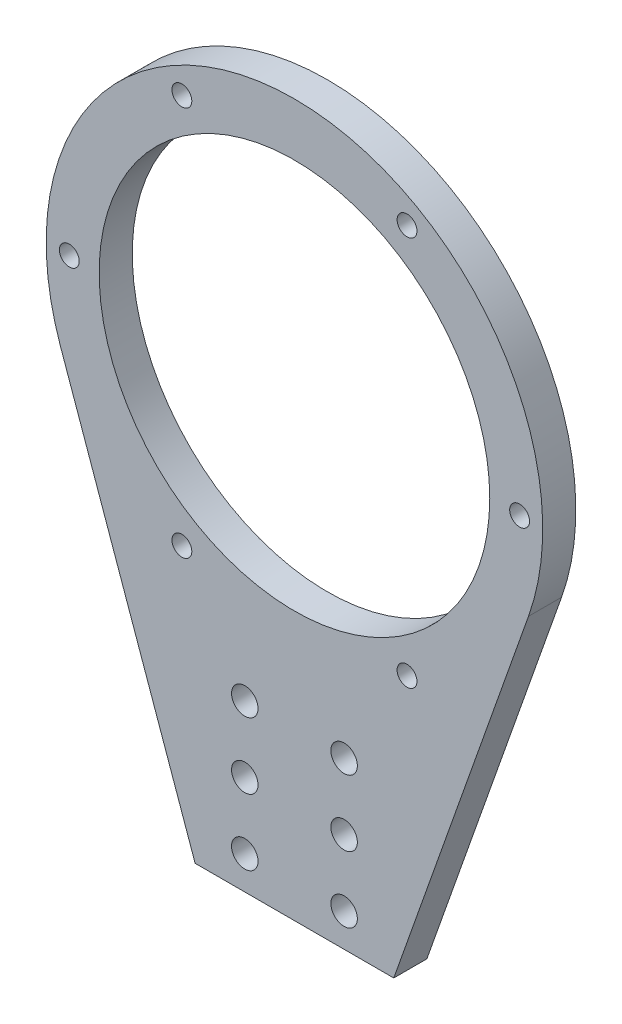
ISO-10303-21;
HEADER;
FILE_DESCRIPTION(('STEP AP214'),'2;1');
FILE_NAME('part.step','',(''),(''),'','','');
FILE_SCHEMA(('AUTOMOTIVE_DESIGN { 1 0 10303 214 1 1 1 1 }'));
ENDSEC;
DATA;
#1=APPLICATION_CONTEXT('core data for automotive mechanical design processes');
#2=APPLICATION_PROTOCOL_DEFINITION('international standard','automotive_design',2000,#1);
#3=PRODUCT_CONTEXT('',#1,'mechanical');
#4=PRODUCT('Part','Part','',(#3));
#5=PRODUCT_RELATED_PRODUCT_CATEGORY('part','',(#4));
#6=PRODUCT_DEFINITION_FORMATION('','',#4);
#7=PRODUCT_DEFINITION_CONTEXT('part definition',#1,'design');
#8=PRODUCT_DEFINITION('design','',#6,#7);
#9=PRODUCT_DEFINITION_SHAPE('','',#8);
#10=(LENGTH_UNIT() NAMED_UNIT(*) SI_UNIT(.MILLI.,.METRE.));
#11=(NAMED_UNIT(*) PLANE_ANGLE_UNIT() SI_UNIT($,.RADIAN.));
#12=(NAMED_UNIT(*) SI_UNIT($,.STERADIAN.) SOLID_ANGLE_UNIT());
#13=UNCERTAINTY_MEASURE_WITH_UNIT(LENGTH_MEASURE(1.E-05),#10,'distance_accuracy_value','');
#14=(GEOMETRIC_REPRESENTATION_CONTEXT(3) GLOBAL_UNCERTAINTY_ASSIGNED_CONTEXT((#13)) GLOBAL_UNIT_ASSIGNED_CONTEXT((#10,
#11,#12)) REPRESENTATION_CONTEXT('',''));
#15=CARTESIAN_POINT('',(0.,0.,0.));
#16=DIRECTION('',(0.,0.,1.));
#17=DIRECTION('',(1.,0.,0.));
#18=AXIS2_PLACEMENT_3D('',#15,#16,#17);
#19=CARTESIAN_POINT('',(0.,0.,5.));
#20=DIRECTION('',(0.,0.,-1.));
#21=DIRECTION('',(-1.,0.,0.));
#22=AXIS2_PLACEMENT_3D('',#19,#20,#21);
#23=CYLINDRICAL_SURFACE('',#22,37.5);
#24=CARTESIAN_POINT('',(0.,0.,0.));
#25=DIRECTION('',(0.,0.,1.));
#26=DIRECTION('',(1.,0.,0.));
#27=AXIS2_PLACEMENT_3D('',#24,#25,#26);
#28=CIRCLE('',#27,37.5);
#29=CARTESIAN_POINT('',(35.3503084476414,-12.5142196183625,0.));
#30=VERTEX_POINT('',#29);
#31=CARTESIAN_POINT('',(-35.3503084476414,-12.5142196183626,0.));
#32=VERTEX_POINT('',#31);
#33=EDGE_CURVE('E108',#30,#32,#28,.T.);
#34=ORIENTED_EDGE('',*,*,#33,.T.);
#35=DIRECTION('',(0.,0.,-1.));
#36=VECTOR('',#35,1.);
#37=CARTESIAN_POINT('',(-35.3503084476414,-12.5142196183626,5.));
#38=LINE('',#37,#36);
#39=CARTESIAN_POINT('',(-35.3503084476414,-12.5142196183626,5.));
#40=VERTEX_POINT('',#39);
#41=EDGE_CURVE('E11',#40,#32,#38,.T.);
#42=ORIENTED_EDGE('',*,*,#41,.F.);
#43=CARTESIAN_POINT('',(0.,0.,5.));
#44=DIRECTION('',(0.,0.,1.));
#45=DIRECTION('',(1.,0.,0.));
#46=AXIS2_PLACEMENT_3D('',#43,#44,#45);
#47=CIRCLE('',#46,37.5);
#48=CARTESIAN_POINT('',(35.3503084476414,-12.5142196183625,5.));
#49=VERTEX_POINT('',#48);
#50=EDGE_CURVE('E81',#49,#40,#47,.T.);
#51=ORIENTED_EDGE('',*,*,#50,.F.);
#52=DIRECTION('',(0.,0.,-1.));
#53=VECTOR('',#52,1.);
#54=CARTESIAN_POINT('',(35.3503084476414,-12.5142196183625,5.));
#55=LINE('',#54,#53);
#56=EDGE_CURVE('E104',#49,#30,#55,.T.);
#57=ORIENTED_EDGE('',*,*,#56,.T.);
#58=EDGE_LOOP('',(#34,#42,#51,#57));
#59=FACE_BOUND('',#58,.T.);
#60=ADVANCED_FACE('F36',(#59),#23,.T.);
#61=CARTESIAN_POINT('',(-35.3503084476414,-12.5142196183626,5.));
#62=DIRECTION('',(-0.942674891937105,-0.333712523156335,0.));
#63=DIRECTION('',(0.333712523156335,-0.942674891937105,0.));
#64=AXIS2_PLACEMENT_3D('',#61,#62,#63);
#65=PLANE('',#64);
#66=DIRECTION('',(-0.333712523156335,0.942674891937105,0.));
#67=VECTOR('',#66,1.);
#68=CARTESIAN_POINT('',(-35.3503084476414,-12.5142196183626,0.));
#69=LINE('',#68,#67);
#70=CARTESIAN_POINT('',(-15.,-70.,0.));
#71=VERTEX_POINT('',#70);
#72=EDGE_CURVE('E91',#71,#32,#69,.T.);
#73=ORIENTED_EDGE('',*,*,#72,.F.);
#74=DIRECTION('',(0.,0.,-1.));
#75=VECTOR('',#74,1.);
#76=CARTESIAN_POINT('',(-15.,-70.,5.));
#77=LINE('',#76,#75);
#78=CARTESIAN_POINT('',(-15.,-70.,5.));
#79=VERTEX_POINT('',#78);
#80=EDGE_CURVE('E46',#79,#71,#77,.T.);
#81=ORIENTED_EDGE('',*,*,#80,.F.);
#82=DIRECTION('',(-0.333712523156335,0.942674891937105,0.));
#83=VECTOR('',#82,1.);
#84=CARTESIAN_POINT('',(-35.3503084476414,-12.5142196183626,5.));
#85=LINE('',#84,#83);
#86=EDGE_CURVE('E89',#79,#40,#85,.T.);
#87=ORIENTED_EDGE('',*,*,#86,.T.);
#88=ORIENTED_EDGE('',*,*,#41,.T.);
#89=EDGE_LOOP('',(#73,#81,#87,#88));
#90=FACE_BOUND('',#89,.T.);
#91=ADVANCED_FACE('F88',(#90),#65,.T.);
#92=CARTESIAN_POINT('',(0.,-70.,5.));
#93=DIRECTION('',(0.,1.,0.));
#94=DIRECTION('',(0.,0.,1.));
#95=AXIS2_PLACEMENT_3D('',#92,#93,#94);
#96=PLANE('',#95);
#97=DIRECTION('',(1.,0.,0.));
#98=VECTOR('',#97,1.);
#99=CARTESIAN_POINT('',(0.,-70.,0.));
#100=LINE('',#99,#98);
#101=CARTESIAN_POINT('',(15.,-70.,0.));
#102=VERTEX_POINT('',#101);
#103=EDGE_CURVE('E70',#71,#102,#100,.T.);
#104=ORIENTED_EDGE('',*,*,#103,.T.);
#105=DIRECTION('',(0.,0.,-1.));
#106=VECTOR('',#105,1.);
#107=CARTESIAN_POINT('',(15.,-70.,5.));
#108=LINE('',#107,#106);
#109=CARTESIAN_POINT('',(15.,-70.,5.));
#110=VERTEX_POINT('',#109);
#111=EDGE_CURVE('E92',#110,#102,#108,.T.);
#112=ORIENTED_EDGE('',*,*,#111,.F.);
#113=DIRECTION('',(1.,0.,0.));
#114=VECTOR('',#113,1.);
#115=CARTESIAN_POINT('',(0.,-70.,5.));
#116=LINE('',#115,#114);
#117=EDGE_CURVE('E94',#79,#110,#116,.T.);
#118=ORIENTED_EDGE('',*,*,#117,.F.);
#119=ORIENTED_EDGE('',*,*,#80,.T.);
#120=EDGE_LOOP('',(#104,#112,#118,#119));
#121=FACE_BOUND('',#120,.T.);
#122=ADVANCED_FACE('F95',(#121),#96,.F.);
#123=CARTESIAN_POINT('',(0.,0.,5.));
#124=DIRECTION('',(0.,0.,-1.));
#125=DIRECTION('',(-1.,0.,0.));
#126=AXIS2_PLACEMENT_3D('',#123,#124,#125);
#127=CYLINDRICAL_SURFACE('',#126,29.5);
#128=CARTESIAN_POINT('',(0.,0.,5.));
#129=DIRECTION('',(0.,0.,1.));
#130=DIRECTION('',(1.,0.,0.));
#131=AXIS2_PLACEMENT_3D('',#128,#129,#130);
#132=CIRCLE('',#131,29.5);
#133=CARTESIAN_POINT('',(29.5,0.,5.));
#134=VERTEX_POINT('',#133);
#135=EDGE_CURVE('E99',#134,#134,#132,.T.);
#136=ORIENTED_EDGE('',*,*,#135,.T.);
#137=EDGE_LOOP('',(#136));
#138=FACE_BOUND('',#137,.T.);
#139=CARTESIAN_POINT('',(0.,0.,0.));
#140=DIRECTION('',(0.,0.,1.));
#141=DIRECTION('',(1.,0.,0.));
#142=AXIS2_PLACEMENT_3D('',#139,#140,#141);
#143=CIRCLE('',#142,29.5);
#144=CARTESIAN_POINT('',(29.5,0.,0.));
#145=VERTEX_POINT('',#144);
#146=EDGE_CURVE('E105',#145,#145,#143,.T.);
#147=ORIENTED_EDGE('',*,*,#146,.F.);
#148=EDGE_LOOP('',(#147));
#149=FACE_BOUND('',#148,.T.);
#150=ADVANCED_FACE('F38',(#138,#149),#127,.F.);
#151=CARTESIAN_POINT('',(35.3503084476414,-12.5142196183625,5.));
#152=DIRECTION('',(-0.942674891937105,0.333712523156334,0.));
#153=DIRECTION('',(-0.333712523156334,-0.942674891937105,0.));
#154=AXIS2_PLACEMENT_3D('',#151,#152,#153);
#155=PLANE('',#154);
#156=DIRECTION('',(0.333712523156335,0.942674891937105,0.));
#157=VECTOR('',#156,1.);
#158=CARTESIAN_POINT('',(35.3503084476414,-12.5142196183625,0.));
#159=LINE('',#158,#157);
#160=EDGE_CURVE('E76',#102,#30,#159,.T.);
#161=ORIENTED_EDGE('',*,*,#160,.T.);
#162=ORIENTED_EDGE('',*,*,#56,.F.);
#163=DIRECTION('',(0.333712523156335,0.942674891937105,0.));
#164=VECTOR('',#163,1.);
#165=CARTESIAN_POINT('',(35.3503084476414,-12.5142196183625,5.));
#166=LINE('',#165,#164);
#167=EDGE_CURVE('E55',#110,#49,#166,.T.);
#168=ORIENTED_EDGE('',*,*,#167,.F.);
#169=ORIENTED_EDGE('',*,*,#111,.T.);
#170=EDGE_LOOP('',(#161,#162,#168,#169));
#171=FACE_BOUND('',#170,.T.);
#172=ADVANCED_FACE('F174',(#171),#155,.F.);
#173=CARTESIAN_POINT('',(0.,0.,5.));
#174=DIRECTION('',(0.,0.,1.));
#175=DIRECTION('',(1.,0.,0.));
#176=AXIS2_PLACEMENT_3D('',#173,#174,#175);
#177=PLANE('',#176);
#178=CARTESIAN_POINT('',(7.50000000000001,-45.,5.));
#179=DIRECTION('',(0.,0.,1.));
#180=DIRECTION('',(1.,0.,0.));
#181=AXIS2_PLACEMENT_3D('',#178,#179,#180);
#182=CIRCLE('',#181,2.);
#183=CARTESIAN_POINT('',(9.50000000000001,-45.,5.));
#184=VERTEX_POINT('',#183);
#185=EDGE_CURVE('E339',#184,#184,#182,.T.);
#186=ORIENTED_EDGE('',*,*,#185,.F.);
#187=EDGE_LOOP('',(#186));
#188=FACE_BOUND('',#187,.T.);
#189=CARTESIAN_POINT('',(-7.49999999999999,-55.,5.));
#190=DIRECTION('',(0.,0.,1.));
#191=DIRECTION('',(1.,0.,0.));
#192=AXIS2_PLACEMENT_3D('',#189,#190,#191);
#193=CIRCLE('',#192,2.00000000000001);
#194=CARTESIAN_POINT('',(-5.49999999999999,-55.,5.));
#195=VERTEX_POINT('',#194);
#196=EDGE_CURVE('E340',#195,#195,#193,.T.);
#197=ORIENTED_EDGE('',*,*,#196,.F.);
#198=EDGE_LOOP('',(#197));
#199=FACE_BOUND('',#198,.T.);
#200=CARTESIAN_POINT('',(-7.49999999999999,-65.,5.));
#201=DIRECTION('',(0.,0.,1.));
#202=DIRECTION('',(1.,0.,0.));
#203=AXIS2_PLACEMENT_3D('',#200,#201,#202);
#204=CIRCLE('',#203,2.);
#205=CARTESIAN_POINT('',(-5.49999999999999,-65.,5.));
#206=VERTEX_POINT('',#205);
#207=EDGE_CURVE('E343',#206,#206,#204,.T.);
#208=ORIENTED_EDGE('',*,*,#207,.F.);
#209=EDGE_LOOP('',(#208));
#210=FACE_BOUND('',#209,.T.);
#211=CARTESIAN_POINT('',(7.50000000000001,-65.,5.));
#212=DIRECTION('',(0.,0.,1.));
#213=DIRECTION('',(1.,0.,0.));
#214=AXIS2_PLACEMENT_3D('',#211,#212,#213);
#215=CIRCLE('',#214,2.);
#216=CARTESIAN_POINT('',(9.50000000000001,-65.,5.));
#217=VERTEX_POINT('',#216);
#218=EDGE_CURVE('E381',#217,#217,#215,.T.);
#219=ORIENTED_EDGE('',*,*,#218,.F.);
#220=EDGE_LOOP('',(#219));
#221=FACE_BOUND('',#220,.T.);
#222=CARTESIAN_POINT('',(7.50000000000001,-55.,5.));
#223=DIRECTION('',(0.,0.,1.));
#224=DIRECTION('',(1.,0.,0.));
#225=AXIS2_PLACEMENT_3D('',#222,#223,#224);
#226=CIRCLE('',#225,2.);
#227=CARTESIAN_POINT('',(9.50000000000001,-55.,5.));
#228=VERTEX_POINT('',#227);
#229=EDGE_CURVE('E349',#228,#228,#226,.T.);
#230=ORIENTED_EDGE('',*,*,#229,.F.);
#231=EDGE_LOOP('',(#230));
#232=FACE_BOUND('',#231,.T.);
#233=CARTESIAN_POINT('',(-7.49999999999999,-45.,5.));
#234=DIRECTION('',(0.,0.,1.));
#235=DIRECTION('',(1.,0.,0.));
#236=AXIS2_PLACEMENT_3D('',#233,#234,#235);
#237=CIRCLE('',#236,2.);
#238=CARTESIAN_POINT('',(-5.49999999999999,-45.,5.));
#239=VERTEX_POINT('',#238);
#240=EDGE_CURVE('E139',#239,#239,#237,.T.);
#241=ORIENTED_EDGE('',*,*,#240,.F.);
#242=EDGE_LOOP('',(#241));
#243=FACE_BOUND('',#242,.T.);
#244=CARTESIAN_POINT('',(-17.0050000000002,29.4535239827087,5.));
#245=DIRECTION('',(0.,0.,1.));
#246=DIRECTION('',(1.,0.,0.));
#247=AXIS2_PLACEMENT_3D('',#244,#245,#246);
#248=CIRCLE('',#247,1.5);
#249=CARTESIAN_POINT('',(-15.5050000000001,29.4535239827087,5.));
#250=VERTEX_POINT('',#249);
#251=EDGE_CURVE('E152',#250,#250,#248,.T.);
#252=ORIENTED_EDGE('',*,*,#251,.F.);
#253=EDGE_LOOP('',(#252));
#254=FACE_BOUND('',#253,.T.);
#255=CARTESIAN_POINT('',(-34.01,0.,5.));
#256=DIRECTION('',(0.,0.,1.));
#257=DIRECTION('',(1.,0.,0.));
#258=AXIS2_PLACEMENT_3D('',#255,#256,#257);
#259=CIRCLE('',#258,1.5);
#260=CARTESIAN_POINT('',(-32.51,0.,5.));
#261=VERTEX_POINT('',#260);
#262=EDGE_CURVE('E156',#261,#261,#259,.T.);
#263=ORIENTED_EDGE('',*,*,#262,.F.);
#264=EDGE_LOOP('',(#263));
#265=FACE_BOUND('',#264,.T.);
#266=CARTESIAN_POINT('',(-17.0050000000001,-29.4535239827087,5.));
#267=DIRECTION('',(0.,0.,1.));
#268=DIRECTION('',(1.,0.,0.));
#269=AXIS2_PLACEMENT_3D('',#266,#267,#268);
#270=CIRCLE('',#269,1.5);
#271=CARTESIAN_POINT('',(-15.5050000000001,-29.4535239827087,5.));
#272=VERTEX_POINT('',#271);
#273=EDGE_CURVE('E161',#272,#272,#270,.T.);
#274=ORIENTED_EDGE('',*,*,#273,.F.);
#275=EDGE_LOOP('',(#274));
#276=FACE_BOUND('',#275,.T.);
#277=CARTESIAN_POINT('',(17.0050000000001,-29.4535239827087,5.));
#278=DIRECTION('',(0.,0.,1.));
#279=DIRECTION('',(1.,0.,0.));
#280=AXIS2_PLACEMENT_3D('',#277,#278,#279);
#281=CIRCLE('',#280,1.50000000000001);
#282=CARTESIAN_POINT('',(18.5050000000002,-29.4535239827087,5.));
#283=VERTEX_POINT('',#282);
#284=EDGE_CURVE('E352',#283,#283,#281,.T.);
#285=ORIENTED_EDGE('',*,*,#284,.F.);
#286=EDGE_LOOP('',(#285));
#287=FACE_BOUND('',#286,.T.);
#288=CARTESIAN_POINT('',(34.01,0.,5.));
#289=DIRECTION('',(0.,0.,1.));
#290=DIRECTION('',(1.,0.,0.));
#291=AXIS2_PLACEMENT_3D('',#288,#289,#290);
#292=CIRCLE('',#291,1.5);
#293=CARTESIAN_POINT('',(35.51,0.,5.));
#294=VERTEX_POINT('',#293);
#295=EDGE_CURVE('E166',#294,#294,#292,.T.);
#296=ORIENTED_EDGE('',*,*,#295,.F.);
#297=EDGE_LOOP('',(#296));
#298=FACE_BOUND('',#297,.T.);
#299=CARTESIAN_POINT('',(17.0050000000001,29.4535239827087,5.));
#300=DIRECTION('',(0.,0.,1.));
#301=DIRECTION('',(1.,0.,0.));
#302=AXIS2_PLACEMENT_3D('',#299,#300,#301);
#303=CIRCLE('',#302,1.5);
#304=CARTESIAN_POINT('',(18.5050000000001,29.4535239827087,5.));
#305=VERTEX_POINT('',#304);
#306=EDGE_CURVE('E121',#305,#305,#303,.T.);
#307=ORIENTED_EDGE('',*,*,#306,.F.);
#308=EDGE_LOOP('',(#307));
#309=FACE_BOUND('',#308,.T.);
#310=ORIENTED_EDGE('',*,*,#135,.F.);
#311=EDGE_LOOP('',(#310));
#312=FACE_BOUND('',#311,.T.);
#313=ORIENTED_EDGE('',*,*,#50,.T.);
#314=ORIENTED_EDGE('',*,*,#86,.F.);
#315=ORIENTED_EDGE('',*,*,#117,.T.);
#316=ORIENTED_EDGE('',*,*,#167,.T.);
#317=EDGE_LOOP('',(#313,#314,#315,#316));
#318=FACE_BOUND('',#317,.T.);
#319=ADVANCED_FACE('F97',(#188,#199,#210,#221,#232,#243,#254,#265,#276,#287,#298,#309,#312,
#318),#177,.T.);
#320=CARTESIAN_POINT('',(0.,0.,0.));
#321=DIRECTION('',(0.,0.,1.));
#322=DIRECTION('',(1.,0.,0.));
#323=AXIS2_PLACEMENT_3D('',#320,#321,#322);
#324=PLANE('',#323);
#325=CARTESIAN_POINT('',(7.50000000000001,-45.,0.));
#326=DIRECTION('',(0.,0.,1.));
#327=DIRECTION('',(1.,0.,0.));
#328=AXIS2_PLACEMENT_3D('',#325,#326,#327);
#329=CIRCLE('',#328,2.);
#330=CARTESIAN_POINT('',(9.50000000000001,-45.,0.));
#331=VERTEX_POINT('',#330);
#332=EDGE_CURVE('E40',#331,#331,#329,.T.);
#333=ORIENTED_EDGE('',*,*,#332,.T.);
#334=EDGE_LOOP('',(#333));
#335=FACE_BOUND('',#334,.T.);
#336=CARTESIAN_POINT('',(-7.49999999999999,-55.,0.));
#337=DIRECTION('',(0.,0.,1.));
#338=DIRECTION('',(1.,0.,0.));
#339=AXIS2_PLACEMENT_3D('',#336,#337,#338);
#340=CIRCLE('',#339,2.00000000000001);
#341=CARTESIAN_POINT('',(-5.49999999999999,-55.,0.));
#342=VERTEX_POINT('',#341);
#343=EDGE_CURVE('E147',#342,#342,#340,.T.);
#344=ORIENTED_EDGE('',*,*,#343,.T.);
#345=EDGE_LOOP('',(#344));
#346=FACE_BOUND('',#345,.T.);
#347=CARTESIAN_POINT('',(-7.49999999999999,-65.,0.));
#348=DIRECTION('',(0.,0.,1.));
#349=DIRECTION('',(1.,0.,0.));
#350=AXIS2_PLACEMENT_3D('',#347,#348,#349);
#351=CIRCLE('',#350,2.);
#352=CARTESIAN_POINT('',(-5.49999999999999,-65.,0.));
#353=VERTEX_POINT('',#352);
#354=EDGE_CURVE('E145',#353,#353,#351,.T.);
#355=ORIENTED_EDGE('',*,*,#354,.T.);
#356=EDGE_LOOP('',(#355));
#357=FACE_BOUND('',#356,.T.);
#358=CARTESIAN_POINT('',(7.50000000000001,-65.,0.));
#359=DIRECTION('',(0.,0.,1.));
#360=DIRECTION('',(1.,0.,0.));
#361=AXIS2_PLACEMENT_3D('',#358,#359,#360);
#362=CIRCLE('',#361,2.);
#363=CARTESIAN_POINT('',(9.50000000000001,-65.,0.));
#364=VERTEX_POINT('',#363);
#365=EDGE_CURVE('E142',#364,#364,#362,.T.);
#366=ORIENTED_EDGE('',*,*,#365,.T.);
#367=EDGE_LOOP('',(#366));
#368=FACE_BOUND('',#367,.T.);
#369=CARTESIAN_POINT('',(7.50000000000001,-55.,0.));
#370=DIRECTION('',(0.,0.,1.));
#371=DIRECTION('',(1.,0.,0.));
#372=AXIS2_PLACEMENT_3D('',#369,#370,#371);
#373=CIRCLE('',#372,2.);
#374=CARTESIAN_POINT('',(9.50000000000001,-55.,0.));
#375=VERTEX_POINT('',#374);
#376=EDGE_CURVE('E138',#375,#375,#373,.T.);
#377=ORIENTED_EDGE('',*,*,#376,.T.);
#378=EDGE_LOOP('',(#377));
#379=FACE_BOUND('',#378,.T.);
#380=CARTESIAN_POINT('',(-7.49999999999999,-45.,0.));
#381=DIRECTION('',(0.,0.,1.));
#382=DIRECTION('',(1.,0.,0.));
#383=AXIS2_PLACEMENT_3D('',#380,#381,#382);
#384=CIRCLE('',#383,2.);
#385=CARTESIAN_POINT('',(-5.49999999999999,-45.,0.));
#386=VERTEX_POINT('',#385);
#387=EDGE_CURVE('E135',#386,#386,#384,.T.);
#388=ORIENTED_EDGE('',*,*,#387,.T.);
#389=EDGE_LOOP('',(#388));
#390=FACE_BOUND('',#389,.T.);
#391=CARTESIAN_POINT('',(-17.0050000000002,29.4535239827087,0.));
#392=DIRECTION('',(0.,0.,1.));
#393=DIRECTION('',(1.,0.,0.));
#394=AXIS2_PLACEMENT_3D('',#391,#392,#393);
#395=CIRCLE('',#394,1.5);
#396=CARTESIAN_POINT('',(-15.5050000000001,29.4535239827087,0.));
#397=VERTEX_POINT('',#396);
#398=EDGE_CURVE('E109',#397,#397,#395,.T.);
#399=ORIENTED_EDGE('',*,*,#398,.T.);
#400=EDGE_LOOP('',(#399));
#401=FACE_BOUND('',#400,.T.);
#402=CARTESIAN_POINT('',(-34.01,0.,0.));
#403=DIRECTION('',(0.,0.,1.));
#404=DIRECTION('',(1.,0.,0.));
#405=AXIS2_PLACEMENT_3D('',#402,#403,#404);
#406=CIRCLE('',#405,1.5);
#407=CARTESIAN_POINT('',(-32.51,0.,0.));
#408=VERTEX_POINT('',#407);
#409=EDGE_CURVE('E130',#408,#408,#406,.T.);
#410=ORIENTED_EDGE('',*,*,#409,.T.);
#411=EDGE_LOOP('',(#410));
#412=FACE_BOUND('',#411,.T.);
#413=CARTESIAN_POINT('',(-17.0050000000001,-29.4535239827087,0.));
#414=DIRECTION('',(0.,0.,1.));
#415=DIRECTION('',(1.,0.,0.));
#416=AXIS2_PLACEMENT_3D('',#413,#414,#415);
#417=CIRCLE('',#416,1.5);
#418=CARTESIAN_POINT('',(-15.5050000000001,-29.4535239827087,0.));
#419=VERTEX_POINT('',#418);
#420=EDGE_CURVE('E127',#419,#419,#417,.T.);
#421=ORIENTED_EDGE('',*,*,#420,.T.);
#422=EDGE_LOOP('',(#421));
#423=FACE_BOUND('',#422,.T.);
#424=CARTESIAN_POINT('',(17.0050000000001,-29.4535239827087,0.));
#425=DIRECTION('',(0.,0.,1.));
#426=DIRECTION('',(1.,0.,0.));
#427=AXIS2_PLACEMENT_3D('',#424,#425,#426);
#428=CIRCLE('',#427,1.50000000000001);
#429=CARTESIAN_POINT('',(18.5050000000002,-29.4535239827087,0.));
#430=VERTEX_POINT('',#429);
#431=EDGE_CURVE('E124',#430,#430,#428,.T.);
#432=ORIENTED_EDGE('',*,*,#431,.T.);
#433=EDGE_LOOP('',(#432));
#434=FACE_BOUND('',#433,.T.);
#435=CARTESIAN_POINT('',(34.01,0.,0.));
#436=DIRECTION('',(0.,0.,1.));
#437=DIRECTION('',(1.,0.,0.));
#438=AXIS2_PLACEMENT_3D('',#435,#436,#437);
#439=CIRCLE('',#438,1.5);
#440=CARTESIAN_POINT('',(35.51,0.,0.));
#441=VERTEX_POINT('',#440);
#442=EDGE_CURVE('E120',#441,#441,#439,.T.);
#443=ORIENTED_EDGE('',*,*,#442,.T.);
#444=EDGE_LOOP('',(#443));
#445=FACE_BOUND('',#444,.T.);
#446=CARTESIAN_POINT('',(17.0050000000001,29.4535239827087,0.));
#447=DIRECTION('',(0.,0.,1.));
#448=DIRECTION('',(1.,0.,0.));
#449=AXIS2_PLACEMENT_3D('',#446,#447,#448);
#450=CIRCLE('',#449,1.5);
#451=CARTESIAN_POINT('',(18.5050000000001,29.4535239827087,0.));
#452=VERTEX_POINT('',#451);
#453=EDGE_CURVE('E117',#452,#452,#450,.T.);
#454=ORIENTED_EDGE('',*,*,#453,.T.);
#455=EDGE_LOOP('',(#454));
#456=FACE_BOUND('',#455,.T.);
#457=ORIENTED_EDGE('',*,*,#146,.T.);
#458=EDGE_LOOP('',(#457));
#459=FACE_BOUND('',#458,.T.);
#460=ORIENTED_EDGE('',*,*,#33,.F.);
#461=ORIENTED_EDGE('',*,*,#160,.F.);
#462=ORIENTED_EDGE('',*,*,#103,.F.);
#463=ORIENTED_EDGE('',*,*,#72,.T.);
#464=EDGE_LOOP('',(#460,#461,#462,#463));
#465=FACE_BOUND('',#464,.T.);
#466=ADVANCED_FACE('F173',(#335,#346,#357,#368,#379,#390,#401,#412,#423,#434,#445,#456,#459,
#465),#324,.F.);
#467=CARTESIAN_POINT('',(17.0050000000001,29.4535239827087,-2.));
#468=DIRECTION('',(0.,0.,1.));
#469=DIRECTION('',(1.,0.,0.));
#470=AXIS2_PLACEMENT_3D('',#467,#468,#469);
#471=CYLINDRICAL_SURFACE('',#470,1.5);
#472=ORIENTED_EDGE('',*,*,#306,.T.);
#473=EDGE_LOOP('',(#472));
#474=FACE_BOUND('',#473,.T.);
#475=ORIENTED_EDGE('',*,*,#453,.F.);
#476=EDGE_LOOP('',(#475));
#477=FACE_BOUND('',#476,.T.);
#478=ADVANCED_FACE('F181',(#474,#477),#471,.F.);
#479=CARTESIAN_POINT('',(34.01,0.,-2.));
#480=DIRECTION('',(0.,0.,1.));
#481=DIRECTION('',(1.,0.,0.));
#482=AXIS2_PLACEMENT_3D('',#479,#480,#481);
#483=CYLINDRICAL_SURFACE('',#482,1.5);
#484=ORIENTED_EDGE('',*,*,#295,.T.);
#485=EDGE_LOOP('',(#484));
#486=FACE_BOUND('',#485,.T.);
#487=ORIENTED_EDGE('',*,*,#442,.F.);
#488=EDGE_LOOP('',(#487));
#489=FACE_BOUND('',#488,.T.);
#490=ADVANCED_FACE('F214',(#486,#489),#483,.F.);
#491=CARTESIAN_POINT('',(17.0050000000001,-29.4535239827087,-2.));
#492=DIRECTION('',(0.,0.,1.));
#493=DIRECTION('',(1.,0.,0.));
#494=AXIS2_PLACEMENT_3D('',#491,#492,#493);
#495=CYLINDRICAL_SURFACE('',#494,1.50000000000001);
#496=ORIENTED_EDGE('',*,*,#284,.T.);
#497=EDGE_LOOP('',(#496));
#498=FACE_BOUND('',#497,.T.);
#499=ORIENTED_EDGE('',*,*,#431,.F.);
#500=EDGE_LOOP('',(#499));
#501=FACE_BOUND('',#500,.T.);
#502=ADVANCED_FACE('F224',(#498,#501),#495,.F.);
#503=CARTESIAN_POINT('',(-17.0050000000001,-29.4535239827087,-2.));
#504=DIRECTION('',(0.,0.,1.));
#505=DIRECTION('',(1.,0.,0.));
#506=AXIS2_PLACEMENT_3D('',#503,#504,#505);
#507=CYLINDRICAL_SURFACE('',#506,1.5);
#508=ORIENTED_EDGE('',*,*,#273,.T.);
#509=EDGE_LOOP('',(#508));
#510=FACE_BOUND('',#509,.T.);
#511=ORIENTED_EDGE('',*,*,#420,.F.);
#512=EDGE_LOOP('',(#511));
#513=FACE_BOUND('',#512,.T.);
#514=ADVANCED_FACE('F234',(#510,#513),#507,.F.);
#515=CARTESIAN_POINT('',(-34.01,0.,-2.));
#516=DIRECTION('',(0.,0.,1.));
#517=DIRECTION('',(1.,0.,0.));
#518=AXIS2_PLACEMENT_3D('',#515,#516,#517);
#519=CYLINDRICAL_SURFACE('',#518,1.5);
#520=ORIENTED_EDGE('',*,*,#262,.T.);
#521=EDGE_LOOP('',(#520));
#522=FACE_BOUND('',#521,.T.);
#523=ORIENTED_EDGE('',*,*,#409,.F.);
#524=EDGE_LOOP('',(#523));
#525=FACE_BOUND('',#524,.T.);
#526=ADVANCED_FACE('F244',(#522,#525),#519,.F.);
#527=CARTESIAN_POINT('',(-17.0050000000002,29.4535239827087,-2.));
#528=DIRECTION('',(0.,0.,1.));
#529=DIRECTION('',(1.,0.,0.));
#530=AXIS2_PLACEMENT_3D('',#527,#528,#529);
#531=CYLINDRICAL_SURFACE('',#530,1.5);
#532=ORIENTED_EDGE('',*,*,#251,.T.);
#533=EDGE_LOOP('',(#532));
#534=FACE_BOUND('',#533,.T.);
#535=ORIENTED_EDGE('',*,*,#398,.F.);
#536=EDGE_LOOP('',(#535));
#537=FACE_BOUND('',#536,.T.);
#538=ADVANCED_FACE('F254',(#534,#537),#531,.F.);
#539=CARTESIAN_POINT('',(-7.49999999999999,-45.,-2.));
#540=DIRECTION('',(0.,0.,1.));
#541=DIRECTION('',(1.,0.,0.));
#542=AXIS2_PLACEMENT_3D('',#539,#540,#541);
#543=CYLINDRICAL_SURFACE('',#542,2.);
#544=ORIENTED_EDGE('',*,*,#240,.T.);
#545=EDGE_LOOP('',(#544));
#546=FACE_BOUND('',#545,.T.);
#547=ORIENTED_EDGE('',*,*,#387,.F.);
#548=EDGE_LOOP('',(#547));
#549=FACE_BOUND('',#548,.T.);
#550=ADVANCED_FACE('F263',(#546,#549),#543,.F.);
#551=CARTESIAN_POINT('',(7.50000000000001,-55.,-2.));
#552=DIRECTION('',(0.,0.,1.));
#553=DIRECTION('',(1.,0.,0.));
#554=AXIS2_PLACEMENT_3D('',#551,#552,#553);
#555=CYLINDRICAL_SURFACE('',#554,2.);
#556=ORIENTED_EDGE('',*,*,#229,.T.);
#557=EDGE_LOOP('',(#556));
#558=FACE_BOUND('',#557,.T.);
#559=ORIENTED_EDGE('',*,*,#376,.F.);
#560=EDGE_LOOP('',(#559));
#561=FACE_BOUND('',#560,.T.);
#562=ADVANCED_FACE('F283',(#558,#561),#555,.F.);
#563=CARTESIAN_POINT('',(7.50000000000001,-65.,-2.));
#564=DIRECTION('',(0.,0.,1.));
#565=DIRECTION('',(1.,0.,0.));
#566=AXIS2_PLACEMENT_3D('',#563,#564,#565);
#567=CYLINDRICAL_SURFACE('',#566,2.);
#568=ORIENTED_EDGE('',*,*,#218,.T.);
#569=EDGE_LOOP('',(#568));
#570=FACE_BOUND('',#569,.T.);
#571=ORIENTED_EDGE('',*,*,#365,.F.);
#572=EDGE_LOOP('',(#571));
#573=FACE_BOUND('',#572,.T.);
#574=ADVANCED_FACE('F293',(#570,#573),#567,.F.);
#575=CARTESIAN_POINT('',(-7.49999999999999,-65.,-2.));
#576=DIRECTION('',(0.,0.,1.));
#577=DIRECTION('',(1.,0.,0.));
#578=AXIS2_PLACEMENT_3D('',#575,#576,#577);
#579=CYLINDRICAL_SURFACE('',#578,2.);
#580=ORIENTED_EDGE('',*,*,#207,.T.);
#581=EDGE_LOOP('',(#580));
#582=FACE_BOUND('',#581,.T.);
#583=ORIENTED_EDGE('',*,*,#354,.F.);
#584=EDGE_LOOP('',(#583));
#585=FACE_BOUND('',#584,.T.);
#586=ADVANCED_FACE('F303',(#582,#585),#579,.F.);
#587=CARTESIAN_POINT('',(-7.49999999999999,-55.,-2.));
#588=DIRECTION('',(0.,0.,1.));
#589=DIRECTION('',(1.,0.,0.));
#590=AXIS2_PLACEMENT_3D('',#587,#588,#589);
#591=CYLINDRICAL_SURFACE('',#590,2.00000000000001);
#592=ORIENTED_EDGE('',*,*,#196,.T.);
#593=EDGE_LOOP('',(#592));
#594=FACE_BOUND('',#593,.T.);
#595=ORIENTED_EDGE('',*,*,#343,.F.);
#596=EDGE_LOOP('',(#595));
#597=FACE_BOUND('',#596,.T.);
#598=ADVANCED_FACE('F313',(#594,#597),#591,.F.);
#599=CARTESIAN_POINT('',(7.50000000000001,-45.,-2.));
#600=DIRECTION('',(0.,0.,1.));
#601=DIRECTION('',(1.,0.,0.));
#602=AXIS2_PLACEMENT_3D('',#599,#600,#601);
#603=CYLINDRICAL_SURFACE('',#602,2.);
#604=ORIENTED_EDGE('',*,*,#185,.T.);
#605=EDGE_LOOP('',(#604));
#606=FACE_BOUND('',#605,.T.);
#607=ORIENTED_EDGE('',*,*,#332,.F.);
#608=EDGE_LOOP('',(#607));
#609=FACE_BOUND('',#608,.T.);
#610=ADVANCED_FACE('F323',(#606,#609),#603,.F.);
#611=CLOSED_SHELL('',(#60,#91,#122,#150,#172,#319,#466,#478,#490,#502,#514,#526,#538,#550,#562,
#574,#586,#598,#610));
#612=MANIFOLD_SOLID_BREP('B2',#611);
#613=ADVANCED_BREP_SHAPE_REPRESENTATION('',(#18,#612),#14);
#614=SHAPE_DEFINITION_REPRESENTATION(#9,#613);
ENDSEC;
END-ISO-10303-21;
